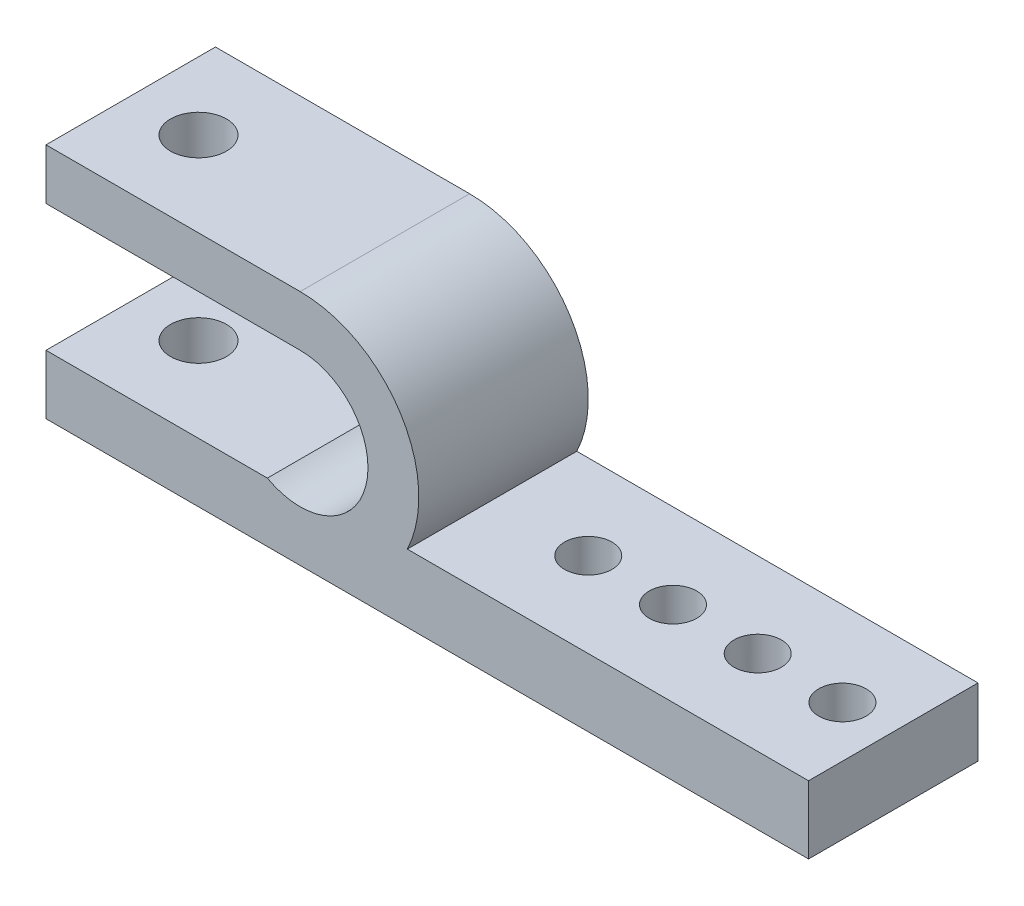
ISO-10303-21;
HEADER;
FILE_DESCRIPTION(('STEP AP214'),'2;1');
FILE_NAME('part.step','',(''),(''),'','','');
FILE_SCHEMA(('AUTOMOTIVE_DESIGN { 1 0 10303 214 1 1 1 1 }'));
ENDSEC;
DATA;
#1=APPLICATION_CONTEXT('core data for automotive mechanical design processes');
#2=APPLICATION_PROTOCOL_DEFINITION('international standard','automotive_design',2000,#1);
#3=PRODUCT_CONTEXT('',#1,'mechanical');
#4=PRODUCT('Part','Part','',(#3));
#5=PRODUCT_RELATED_PRODUCT_CATEGORY('part','',(#4));
#6=PRODUCT_DEFINITION_FORMATION('','',#4);
#7=PRODUCT_DEFINITION_CONTEXT('part definition',#1,'design');
#8=PRODUCT_DEFINITION('design','',#6,#7);
#9=PRODUCT_DEFINITION_SHAPE('','',#8);
#10=(LENGTH_UNIT() NAMED_UNIT(*) SI_UNIT(.MILLI.,.METRE.));
#11=(NAMED_UNIT(*) PLANE_ANGLE_UNIT() SI_UNIT($,.RADIAN.));
#12=(NAMED_UNIT(*) SI_UNIT($,.STERADIAN.) SOLID_ANGLE_UNIT());
#13=UNCERTAINTY_MEASURE_WITH_UNIT(LENGTH_MEASURE(1.E-05),#10,'distance_accuracy_value','');
#14=(GEOMETRIC_REPRESENTATION_CONTEXT(3) GLOBAL_UNCERTAINTY_ASSIGNED_CONTEXT((#13)) GLOBAL_UNIT_ASSIGNED_CONTEXT((#10,
#11,#12)) REPRESENTATION_CONTEXT('',''));
#15=CARTESIAN_POINT('',(0.,0.,0.));
#16=DIRECTION('',(0.,0.,1.));
#17=DIRECTION('',(1.,0.,0.));
#18=AXIS2_PLACEMENT_3D('',#15,#16,#17);
#19=CARTESIAN_POINT('',(11.6796940551831,13.1067984525851,10.));
#20=DIRECTION('',(0.,-1.,0.));
#21=DIRECTION('',(1.,0.,0.));
#22=AXIS2_PLACEMENT_3D('',#19,#20,#21);
#23=PLANE('',#22);
#24=CARTESIAN_POINT('',(0.679694055183151,13.1067984525851,5.));
#25=DIRECTION('',(0.,1.,0.));
#26=DIRECTION('',(0.,0.,1.));
#27=AXIS2_PLACEMENT_3D('',#24,#25,#26);
#28=CIRCLE('',#27,1.65);
#29=CARTESIAN_POINT('',(0.679694055183151,13.1067984525851,6.65));
#30=VERTEX_POINT('',#29);
#31=EDGE_CURVE('E184',#30,#30,#28,.T.);
#32=ORIENTED_EDGE('',*,*,#31,.T.);
#33=EDGE_LOOP('',(#32));
#34=FACE_BOUND('',#33,.T.);
#35=CARTESIAN_POINT('',(28.6796940551831,13.1067984525851,5.));
#36=DIRECTION('',(0.,-1.,0.));
#37=DIRECTION('',(1.,0.,0.));
#38=AXIS2_PLACEMENT_3D('',#35,#36,#37);
#39=CIRCLE('',#38,1.4);
#40=CARTESIAN_POINT('',(30.0796940551831,13.1067984525851,5.));
#41=VERTEX_POINT('',#40);
#42=EDGE_CURVE('E173',#41,#41,#39,.F.);
#43=ORIENTED_EDGE('',*,*,#42,.T.);
#44=EDGE_LOOP('',(#43));
#45=FACE_BOUND('',#44,.T.);
#46=CARTESIAN_POINT('',(23.6796940551831,13.1067984525851,5.));
#47=DIRECTION('',(0.,-1.,0.));
#48=DIRECTION('',(1.,0.,0.));
#49=AXIS2_PLACEMENT_3D('',#46,#47,#48);
#50=CIRCLE('',#49,1.4);
#51=CARTESIAN_POINT('',(25.0796940551831,13.1067984525851,5.));
#52=VERTEX_POINT('',#51);
#53=EDGE_CURVE('E168',#52,#52,#50,.F.);
#54=ORIENTED_EDGE('',*,*,#53,.T.);
#55=EDGE_LOOP('',(#54));
#56=FACE_BOUND('',#55,.T.);
#57=DIRECTION('',(-1.,0.,0.));
#58=VECTOR('',#57,1.);
#59=CARTESIAN_POINT('',(11.6796940551831,13.1067984525851,0.));
#60=LINE('',#59,#58);
#61=CARTESIAN_POINT('',(41.6796940551831,13.1067984525851,0.));
#62=VERTEX_POINT('',#61);
#63=CARTESIAN_POINT('',(-3.32030594481686,13.1067984525851,0.));
#64=VERTEX_POINT('',#63);
#65=EDGE_CURVE('E155',#62,#64,#60,.T.);
#66=ORIENTED_EDGE('',*,*,#65,.F.);
#67=DIRECTION('',(0.,0.,1.));
#68=VECTOR('',#67,1.);
#69=CARTESIAN_POINT('',(41.6796940551831,13.1067984525851,0.));
#70=LINE('',#69,#68);
#71=CARTESIAN_POINT('',(41.6796940551831,13.1067984525851,10.));
#72=VERTEX_POINT('',#71);
#73=EDGE_CURVE('E205',#62,#72,#70,.T.);
#74=ORIENTED_EDGE('',*,*,#73,.T.);
#75=DIRECTION('',(-1.,0.,0.));
#76=VECTOR('',#75,1.);
#77=CARTESIAN_POINT('',(11.6796940551831,13.1067984525851,10.));
#78=LINE('',#77,#76);
#79=CARTESIAN_POINT('',(-3.32030594481686,13.1067984525851,10.));
#80=VERTEX_POINT('',#79);
#81=EDGE_CURVE('E136',#72,#80,#78,.T.);
#82=ORIENTED_EDGE('',*,*,#81,.T.);
#83=DIRECTION('',(0.,0.,-1.));
#84=VECTOR('',#83,1.);
#85=CARTESIAN_POINT('',(-3.32030594481686,13.1067984525851,10.));
#86=LINE('',#85,#84);
#87=EDGE_CURVE('E59',#80,#64,#86,.T.);
#88=ORIENTED_EDGE('',*,*,#87,.T.);
#89=EDGE_LOOP('',(#66,#74,#82,#88));
#90=FACE_BOUND('',#89,.T.);
#91=CARTESIAN_POINT('',(33.6796940551831,13.1067984525851,5.));
#92=DIRECTION('',(0.,-1.,0.));
#93=DIRECTION('',(1.,0.,0.));
#94=AXIS2_PLACEMENT_3D('',#91,#92,#93);
#95=CIRCLE('',#94,1.4);
#96=CARTESIAN_POINT('',(35.0796940551831,13.1067984525851,5.));
#97=VERTEX_POINT('',#96);
#98=EDGE_CURVE('E169',#97,#97,#95,.F.);
#99=ORIENTED_EDGE('',*,*,#98,.T.);
#100=EDGE_LOOP('',(#99));
#101=FACE_BOUND('',#100,.T.);
#102=CARTESIAN_POINT('',(38.6796940551831,13.1067984525851,5.));
#103=DIRECTION('',(0.,-1.,0.));
#104=DIRECTION('',(1.,0.,0.));
#105=AXIS2_PLACEMENT_3D('',#102,#103,#104);
#106=CIRCLE('',#105,1.4);
#107=CARTESIAN_POINT('',(40.0796940551831,13.1067984525851,5.));
#108=VERTEX_POINT('',#107);
#109=EDGE_CURVE('E176',#108,#108,#106,.F.);
#110=ORIENTED_EDGE('',*,*,#109,.T.);
#111=EDGE_LOOP('',(#110));
#112=FACE_BOUND('',#111,.T.);
#113=ADVANCED_FACE('F33',(#34,#45,#56,#90,#101,#112),#23,.T.);
#114=CARTESIAN_POINT('',(41.6796940551831,17.1067984525851,0.));
#115=DIRECTION('',(0.,1.,0.));
#116=DIRECTION('',(0.,0.,1.));
#117=AXIS2_PLACEMENT_3D('',#114,#115,#116);
#118=PLANE('',#117);
#119=CARTESIAN_POINT('',(28.6796940551831,17.1067984525851,5.));
#120=DIRECTION('',(0.,1.,0.));
#121=DIRECTION('',(0.,0.,1.));
#122=AXIS2_PLACEMENT_3D('',#119,#120,#121);
#123=CIRCLE('',#122,1.4);
#124=CARTESIAN_POINT('',(28.6796940551831,17.1067984525851,6.4));
#125=VERTEX_POINT('',#124);
#126=EDGE_CURVE('E174',#125,#125,#123,.F.);
#127=ORIENTED_EDGE('',*,*,#126,.T.);
#128=EDGE_LOOP('',(#127));
#129=FACE_BOUND('',#128,.T.);
#130=CARTESIAN_POINT('',(23.6796940551831,17.1067984525851,5.));
#131=DIRECTION('',(0.,1.,0.));
#132=DIRECTION('',(0.,0.,1.));
#133=AXIS2_PLACEMENT_3D('',#130,#131,#132);
#134=CIRCLE('',#133,1.4);
#135=CARTESIAN_POINT('',(23.6796940551831,17.1067984525851,6.4));
#136=VERTEX_POINT('',#135);
#137=EDGE_CURVE('E165',#136,#136,#134,.F.);
#138=ORIENTED_EDGE('',*,*,#137,.T.);
#139=EDGE_LOOP('',(#138));
#140=FACE_BOUND('',#139,.T.);
#141=DIRECTION('',(0.,0.,-1.));
#142=VECTOR('',#141,1.);
#143=CARTESIAN_POINT('',(18.0042493755199,17.1067984525851,10.));
#144=LINE('',#143,#142);
#145=CARTESIAN_POINT('',(18.0042493755199,17.1067984525851,10.));
#146=VERTEX_POINT('',#145);
#147=CARTESIAN_POINT('',(18.0042493755199,17.1067984525851,0.));
#148=VERTEX_POINT('',#147);
#149=EDGE_CURVE('E212',#146,#148,#144,.T.);
#150=ORIENTED_EDGE('',*,*,#149,.F.);
#151=DIRECTION('',(-1.,0.,0.));
#152=VECTOR('',#151,1.);
#153=CARTESIAN_POINT('',(41.6796940551831,17.1067984525851,10.));
#154=LINE('',#153,#152);
#155=CARTESIAN_POINT('',(41.6796940551831,17.1067984525851,10.));
#156=VERTEX_POINT('',#155);
#157=EDGE_CURVE('E50',#156,#146,#154,.T.);
#158=ORIENTED_EDGE('',*,*,#157,.F.);
#159=DIRECTION('',(0.,0.,1.));
#160=VECTOR('',#159,1.);
#161=CARTESIAN_POINT('',(41.6796940551831,17.1067984525851,0.));
#162=LINE('',#161,#160);
#163=CARTESIAN_POINT('',(41.6796940551831,17.1067984525851,0.));
#164=VERTEX_POINT('',#163);
#165=EDGE_CURVE('E209',#164,#156,#162,.T.);
#166=ORIENTED_EDGE('',*,*,#165,.F.);
#167=DIRECTION('',(-1.,0.,0.));
#168=VECTOR('',#167,1.);
#169=CARTESIAN_POINT('',(41.6796940551831,17.1067984525851,0.));
#170=LINE('',#169,#168);
#171=EDGE_CURVE('E198',#164,#148,#170,.T.);
#172=ORIENTED_EDGE('',*,*,#171,.T.);
#173=EDGE_LOOP('',(#150,#158,#166,#172));
#174=FACE_BOUND('',#173,.T.);
#175=CARTESIAN_POINT('',(33.6796940551831,17.1067984525851,5.));
#176=DIRECTION('',(0.,1.,0.));
#177=DIRECTION('',(0.,0.,1.));
#178=AXIS2_PLACEMENT_3D('',#175,#176,#177);
#179=CIRCLE('',#178,1.4);
#180=CARTESIAN_POINT('',(33.6796940551831,17.1067984525851,6.4));
#181=VERTEX_POINT('',#180);
#182=EDGE_CURVE('E170',#181,#181,#179,.F.);
#183=ORIENTED_EDGE('',*,*,#182,.T.);
#184=EDGE_LOOP('',(#183));
#185=FACE_BOUND('',#184,.T.);
#186=CARTESIAN_POINT('',(38.6796940551831,17.1067984525851,5.));
#187=DIRECTION('',(0.,1.,0.));
#188=DIRECTION('',(0.,0.,1.));
#189=AXIS2_PLACEMENT_3D('',#186,#187,#188);
#190=CIRCLE('',#189,1.4);
#191=CARTESIAN_POINT('',(38.6796940551831,17.1067984525851,6.4));
#192=VERTEX_POINT('',#191);
#193=EDGE_CURVE('E177',#192,#192,#190,.F.);
#194=ORIENTED_EDGE('',*,*,#193,.T.);
#195=EDGE_LOOP('',(#194));
#196=FACE_BOUND('',#195,.T.);
#197=ADVANCED_FACE('F254',(#129,#140,#174,#185,#196),#118,.T.);
#198=CARTESIAN_POINT('',(11.6796940551831,20.1067984525851,10.));
#199=DIRECTION('',(0.,0.,-1.));
#200=DIRECTION('',(-1.,0.,0.));
#201=AXIS2_PLACEMENT_3D('',#198,#199,#200);
#202=CYLINDRICAL_SURFACE('',#201,7.);
#203=CARTESIAN_POINT('',(11.6796940551831,20.1067984525851,10.));
#204=DIRECTION('',(0.,0.,1.));
#205=DIRECTION('',(1.,0.,0.));
#206=AXIS2_PLACEMENT_3D('',#203,#204,#205);
#207=CIRCLE('',#206,7.);
#208=CARTESIAN_POINT('',(11.6796940551831,27.1067984525851,10.));
#209=VERTEX_POINT('',#208);
#210=EDGE_CURVE('E93',#146,#209,#207,.T.);
#211=ORIENTED_EDGE('',*,*,#210,.F.);
#212=ORIENTED_EDGE('',*,*,#149,.T.);
#213=CARTESIAN_POINT('',(11.6796940551831,20.1067984525851,0.));
#214=DIRECTION('',(0.,0.,1.));
#215=DIRECTION('',(1.,0.,0.));
#216=AXIS2_PLACEMENT_3D('',#213,#214,#215);
#217=CIRCLE('',#216,7.);
#218=CARTESIAN_POINT('',(11.6796940551831,27.1067984525851,0.));
#219=VERTEX_POINT('',#218);
#220=EDGE_CURVE('E138',#148,#219,#217,.T.);
#221=ORIENTED_EDGE('',*,*,#220,.T.);
#222=DIRECTION('',(0.,0.,-1.));
#223=VECTOR('',#222,1.);
#224=CARTESIAN_POINT('',(11.6796940551831,27.1067984525851,10.));
#225=LINE('',#224,#223);
#226=EDGE_CURVE('E11',#209,#219,#225,.T.);
#227=ORIENTED_EDGE('',*,*,#226,.F.);
#228=EDGE_LOOP('',(#211,#212,#221,#227));
#229=FACE_BOUND('',#228,.T.);
#230=ADVANCED_FACE('F35',(#229),#202,.T.);
#231=CARTESIAN_POINT('',(11.6796940551831,27.1067984525851,10.));
#232=DIRECTION('',(0.,-1.,0.));
#233=DIRECTION('',(0.,0.,-1.));
#234=AXIS2_PLACEMENT_3D('',#231,#232,#233);
#235=PLANE('',#234);
#236=CARTESIAN_POINT('',(0.679694055183151,27.1067984525851,5.));
#237=DIRECTION('',(0.,1.,0.));
#238=DIRECTION('',(-1.,0.,0.));
#239=AXIS2_PLACEMENT_3D('',#236,#237,#238);
#240=CIRCLE('',#239,1.65);
#241=CARTESIAN_POINT('',(-0.97030594481685,27.1067984525851,5.));
#242=VERTEX_POINT('',#241);
#243=EDGE_CURVE('E217',#242,#242,#240,.T.);
#244=ORIENTED_EDGE('',*,*,#243,.F.);
#245=EDGE_LOOP('',(#244));
#246=FACE_BOUND('',#245,.T.);
#247=DIRECTION('',(-1.,0.,0.));
#248=VECTOR('',#247,1.);
#249=CARTESIAN_POINT('',(11.6796940551831,27.1067984525851,0.));
#250=LINE('',#249,#248);
#251=CARTESIAN_POINT('',(-3.32030594481686,27.1067984525851,0.));
#252=VERTEX_POINT('',#251);
#253=EDGE_CURVE('E140',#219,#252,#250,.T.);
#254=ORIENTED_EDGE('',*,*,#253,.T.);
#255=DIRECTION('',(0.,0.,-1.));
#256=VECTOR('',#255,1.);
#257=CARTESIAN_POINT('',(-3.32030594481686,27.1067984525851,10.));
#258=LINE('',#257,#256);
#259=CARTESIAN_POINT('',(-3.32030594481686,27.1067984525851,10.));
#260=VERTEX_POINT('',#259);
#261=EDGE_CURVE('E42',#260,#252,#258,.T.);
#262=ORIENTED_EDGE('',*,*,#261,.F.);
#263=DIRECTION('',(-1.,0.,0.));
#264=VECTOR('',#263,1.);
#265=CARTESIAN_POINT('',(11.6796940551831,27.1067984525851,10.));
#266=LINE('',#265,#264);
#267=EDGE_CURVE('E223',#209,#260,#266,.T.);
#268=ORIENTED_EDGE('',*,*,#267,.F.);
#269=ORIENTED_EDGE('',*,*,#226,.T.);
#270=EDGE_LOOP('',(#254,#262,#268,#269));
#271=FACE_BOUND('',#270,.T.);
#272=ADVANCED_FACE('F259',(#246,#271),#235,.F.);
#273=CARTESIAN_POINT('',(-3.32030594481686,27.1067984525851,10.));
#274=DIRECTION('',(1.,0.,0.));
#275=DIRECTION('',(0.,1.,0.));
#276=AXIS2_PLACEMENT_3D('',#273,#274,#275);
#277=PLANE('',#276);
#278=DIRECTION('',(0.,-1.,0.));
#279=VECTOR('',#278,1.);
#280=CARTESIAN_POINT('',(-3.32030594481686,27.1067984525851,0.));
#281=LINE('',#280,#279);
#282=CARTESIAN_POINT('',(-3.32030594481686,24.1067984525851,0.));
#283=VERTEX_POINT('',#282);
#284=EDGE_CURVE('E143',#252,#283,#281,.T.);
#285=ORIENTED_EDGE('',*,*,#284,.T.);
#286=DIRECTION('',(0.,0.,-1.));
#287=VECTOR('',#286,1.);
#288=CARTESIAN_POINT('',(-3.32030594481686,24.1067984525851,10.));
#289=LINE('',#288,#287);
#290=CARTESIAN_POINT('',(-3.32030594481686,24.1067984525851,10.));
#291=VERTEX_POINT('',#290);
#292=EDGE_CURVE('E161',#291,#283,#289,.T.);
#293=ORIENTED_EDGE('',*,*,#292,.F.);
#294=DIRECTION('',(0.,-1.,0.));
#295=VECTOR('',#294,1.);
#296=CARTESIAN_POINT('',(-3.32030594481686,27.1067984525851,10.));
#297=LINE('',#296,#295);
#298=EDGE_CURVE('E131',#260,#291,#297,.T.);
#299=ORIENTED_EDGE('',*,*,#298,.F.);
#300=ORIENTED_EDGE('',*,*,#261,.T.);
#301=EDGE_LOOP('',(#285,#293,#299,#300));
#302=FACE_BOUND('',#301,.T.);
#303=ADVANCED_FACE('F228',(#302),#277,.F.);
#304=CARTESIAN_POINT('',(11.6796940551831,24.1067984525851,10.));
#305=DIRECTION('',(0.,-1.,0.));
#306=DIRECTION('',(0.,0.,-1.));
#307=AXIS2_PLACEMENT_3D('',#304,#305,#306);
#308=PLANE('',#307);
#309=CARTESIAN_POINT('',(0.679694055183152,24.1067984525851,5.));
#310=DIRECTION('',(0.,-1.,0.));
#311=DIRECTION('',(0.,0.,-1.));
#312=AXIS2_PLACEMENT_3D('',#309,#310,#311);
#313=CIRCLE('',#312,1.65);
#314=CARTESIAN_POINT('',(0.679694055183152,24.1067984525851,3.35));
#315=VERTEX_POINT('',#314);
#316=EDGE_CURVE('E141',#315,#315,#313,.T.);
#317=ORIENTED_EDGE('',*,*,#316,.F.);
#318=EDGE_LOOP('',(#317));
#319=FACE_BOUND('',#318,.T.);
#320=DIRECTION('',(-1.,0.,0.));
#321=VECTOR('',#320,1.);
#322=CARTESIAN_POINT('',(11.6796940551831,24.1067984525851,0.));
#323=LINE('',#322,#321);
#324=CARTESIAN_POINT('',(11.6796940551831,24.1067984525851,0.));
#325=VERTEX_POINT('',#324);
#326=EDGE_CURVE('E146',#325,#283,#323,.T.);
#327=ORIENTED_EDGE('',*,*,#326,.F.);
#328=DIRECTION('',(0.,0.,-1.));
#329=VECTOR('',#328,1.);
#330=CARTESIAN_POINT('',(11.6796940551831,24.1067984525851,10.));
#331=LINE('',#330,#329);
#332=CARTESIAN_POINT('',(11.6796940551831,24.1067984525851,10.));
#333=VERTEX_POINT('',#332);
#334=EDGE_CURVE('E118',#333,#325,#331,.T.);
#335=ORIENTED_EDGE('',*,*,#334,.F.);
#336=DIRECTION('',(-1.,0.,0.));
#337=VECTOR('',#336,1.);
#338=CARTESIAN_POINT('',(11.6796940551831,24.1067984525851,10.));
#339=LINE('',#338,#337);
#340=EDGE_CURVE('E129',#333,#291,#339,.T.);
#341=ORIENTED_EDGE('',*,*,#340,.T.);
#342=ORIENTED_EDGE('',*,*,#292,.T.);
#343=EDGE_LOOP('',(#327,#335,#341,#342));
#344=FACE_BOUND('',#343,.T.);
#345=ADVANCED_FACE('F232',(#319,#344),#308,.T.);
#346=CARTESIAN_POINT('',(11.6796940551831,20.1067984525851,10.));
#347=DIRECTION('',(0.,0.,-1.));
#348=DIRECTION('',(-1.,0.,0.));
#349=AXIS2_PLACEMENT_3D('',#346,#347,#348);
#350=CYLINDRICAL_SURFACE('',#349,4.);
#351=ORIENTED_EDGE('',*,*,#334,.T.);
#352=CARTESIAN_POINT('',(11.6796940551831,20.1067984525851,0.));
#353=DIRECTION('',(0.,0.,1.));
#354=DIRECTION('',(1.,0.,0.));
#355=AXIS2_PLACEMENT_3D('',#352,#353,#354);
#356=CIRCLE('',#355,4.);
#357=CARTESIAN_POINT('',(9.74320238207943,16.6067984525851,0.));
#358=VERTEX_POINT('',#357);
#359=EDGE_CURVE('E114',#358,#325,#356,.T.);
#360=ORIENTED_EDGE('',*,*,#359,.F.);
#361=DIRECTION('',(0.,0.,-1.));
#362=VECTOR('',#361,1.);
#363=CARTESIAN_POINT('',(9.74320238207943,16.6067984525851,10.));
#364=LINE('',#363,#362);
#365=CARTESIAN_POINT('',(9.74320238207943,16.6067984525851,10.));
#366=VERTEX_POINT('',#365);
#367=EDGE_CURVE('E107',#366,#358,#364,.T.);
#368=ORIENTED_EDGE('',*,*,#367,.F.);
#369=CARTESIAN_POINT('',(11.6796940551831,20.1067984525851,10.));
#370=DIRECTION('',(0.,0.,1.));
#371=DIRECTION('',(1.,0.,0.));
#372=AXIS2_PLACEMENT_3D('',#369,#370,#371);
#373=CIRCLE('',#372,4.);
#374=EDGE_CURVE('E112',#366,#333,#373,.T.);
#375=ORIENTED_EDGE('',*,*,#374,.T.);
#376=EDGE_LOOP('',(#351,#360,#368,#375));
#377=FACE_BOUND('',#376,.T.);
#378=ADVANCED_FACE('F110',(#377),#350,.F.);
#379=CARTESIAN_POINT('',(9.74320238207943,16.6067984525851,10.));
#380=DIRECTION('',(0.,-1.,0.));
#381=DIRECTION('',(1.,0.,0.));
#382=AXIS2_PLACEMENT_3D('',#379,#380,#381);
#383=PLANE('',#382);
#384=CARTESIAN_POINT('',(0.679694055183151,16.6067984525851,5.));
#385=DIRECTION('',(0.,-1.,0.));
#386=DIRECTION('',(1.,0.,0.));
#387=AXIS2_PLACEMENT_3D('',#384,#385,#386);
#388=CIRCLE('',#387,1.65);
#389=CARTESIAN_POINT('',(2.32969405518315,16.6067984525851,5.));
#390=VERTEX_POINT('',#389);
#391=EDGE_CURVE('E37',#390,#390,#388,.T.);
#392=ORIENTED_EDGE('',*,*,#391,.T.);
#393=EDGE_LOOP('',(#392));
#394=FACE_BOUND('',#393,.T.);
#395=DIRECTION('',(-1.,0.,0.));
#396=VECTOR('',#395,1.);
#397=CARTESIAN_POINT('',(9.74320238207943,16.6067984525851,0.));
#398=LINE('',#397,#396);
#399=CARTESIAN_POINT('',(-3.32030594481686,16.6067984525851,0.));
#400=VERTEX_POINT('',#399);
#401=EDGE_CURVE('E150',#358,#400,#398,.T.);
#402=ORIENTED_EDGE('',*,*,#401,.T.);
#403=DIRECTION('',(0.,0.,-1.));
#404=VECTOR('',#403,1.);
#405=CARTESIAN_POINT('',(-3.32030594481686,16.6067984525851,10.));
#406=LINE('',#405,#404);
#407=CARTESIAN_POINT('',(-3.32030594481686,16.6067984525851,10.));
#408=VERTEX_POINT('',#407);
#409=EDGE_CURVE('E119',#408,#400,#406,.T.);
#410=ORIENTED_EDGE('',*,*,#409,.F.);
#411=DIRECTION('',(-1.,0.,0.));
#412=VECTOR('',#411,1.);
#413=CARTESIAN_POINT('',(9.74320238207943,16.6067984525851,10.));
#414=LINE('',#413,#412);
#415=EDGE_CURVE('E122',#366,#408,#414,.T.);
#416=ORIENTED_EDGE('',*,*,#415,.F.);
#417=ORIENTED_EDGE('',*,*,#367,.T.);
#418=EDGE_LOOP('',(#402,#410,#416,#417));
#419=FACE_BOUND('',#418,.T.);
#420=ADVANCED_FACE('F123',(#394,#419),#383,.F.);
#421=CARTESIAN_POINT('',(-3.32030594481686,13.1067984525851,10.));
#422=DIRECTION('',(-1.,0.,0.));
#423=DIRECTION('',(0.,0.,1.));
#424=AXIS2_PLACEMENT_3D('',#421,#422,#423);
#425=PLANE('',#424);
#426=DIRECTION('',(0.,1.,0.));
#427=VECTOR('',#426,1.);
#428=CARTESIAN_POINT('',(-3.32030594481686,13.1067984525851,0.));
#429=LINE('',#428,#427);
#430=EDGE_CURVE('E152',#64,#400,#429,.T.);
#431=ORIENTED_EDGE('',*,*,#430,.F.);
#432=ORIENTED_EDGE('',*,*,#87,.F.);
#433=DIRECTION('',(0.,1.,0.));
#434=VECTOR('',#433,1.);
#435=CARTESIAN_POINT('',(-3.32030594481686,13.1067984525851,10.));
#436=LINE('',#435,#434);
#437=EDGE_CURVE('E124',#80,#408,#436,.T.);
#438=ORIENTED_EDGE('',*,*,#437,.T.);
#439=ORIENTED_EDGE('',*,*,#409,.T.);
#440=EDGE_LOOP('',(#431,#432,#438,#439));
#441=FACE_BOUND('',#440,.T.);
#442=ADVANCED_FACE('F237',(#441),#425,.T.);
#443=CARTESIAN_POINT('',(11.6796940551831,20.1067984525851,10.));
#444=DIRECTION('',(0.,0.,1.));
#445=DIRECTION('',(1.,0.,0.));
#446=AXIS2_PLACEMENT_3D('',#443,#444,#445);
#447=PLANE('',#446);
#448=ORIENTED_EDGE('',*,*,#340,.F.);
#449=ORIENTED_EDGE('',*,*,#374,.F.);
#450=ORIENTED_EDGE('',*,*,#415,.T.);
#451=ORIENTED_EDGE('',*,*,#437,.F.);
#452=ORIENTED_EDGE('',*,*,#81,.F.);
#453=DIRECTION('',(0.,-1.,0.));
#454=VECTOR('',#453,1.);
#455=CARTESIAN_POINT('',(41.6796940551831,17.1067984525851,10.));
#456=LINE('',#455,#454);
#457=EDGE_CURVE('E202',#156,#72,#456,.T.);
#458=ORIENTED_EDGE('',*,*,#457,.F.);
#459=ORIENTED_EDGE('',*,*,#157,.T.);
#460=ORIENTED_EDGE('',*,*,#210,.T.);
#461=ORIENTED_EDGE('',*,*,#267,.T.);
#462=ORIENTED_EDGE('',*,*,#298,.T.);
#463=EDGE_LOOP('',(#448,#449,#450,#451,#452,#458,#459,#460,#461,#462));
#464=FACE_BOUND('',#463,.T.);
#465=ADVANCED_FACE('F127',(#464),#447,.T.);
#466=CARTESIAN_POINT('',(11.6796940551831,20.1067984525851,0.));
#467=DIRECTION('',(0.,0.,1.));
#468=DIRECTION('',(1.,0.,0.));
#469=AXIS2_PLACEMENT_3D('',#466,#467,#468);
#470=PLANE('',#469);
#471=ORIENTED_EDGE('',*,*,#220,.F.);
#472=ORIENTED_EDGE('',*,*,#171,.F.);
#473=DIRECTION('',(0.,-1.,0.));
#474=VECTOR('',#473,1.);
#475=CARTESIAN_POINT('',(41.6796940551831,17.1067984525851,0.));
#476=LINE('',#475,#474);
#477=EDGE_CURVE('E201',#164,#62,#476,.T.);
#478=ORIENTED_EDGE('',*,*,#477,.T.);
#479=ORIENTED_EDGE('',*,*,#65,.T.);
#480=ORIENTED_EDGE('',*,*,#430,.T.);
#481=ORIENTED_EDGE('',*,*,#401,.F.);
#482=ORIENTED_EDGE('',*,*,#359,.T.);
#483=ORIENTED_EDGE('',*,*,#326,.T.);
#484=ORIENTED_EDGE('',*,*,#284,.F.);
#485=ORIENTED_EDGE('',*,*,#253,.F.);
#486=EDGE_LOOP('',(#471,#472,#478,#479,#480,#481,#482,#483,#484,#485));
#487=FACE_BOUND('',#486,.T.);
#488=ADVANCED_FACE('F235',(#487),#470,.F.);
#489=CARTESIAN_POINT('',(0.679694055183157,13.1067984525851,5.));
#490=DIRECTION('',(0.,1.,0.));
#491=DIRECTION('',(-1.,0.,0.));
#492=AXIS2_PLACEMENT_3D('',#489,#490,#491);
#493=CYLINDRICAL_SURFACE('',#492,1.65);
#494=ORIENTED_EDGE('',*,*,#316,.T.);
#495=EDGE_LOOP('',(#494));
#496=FACE_BOUND('',#495,.T.);
#497=ORIENTED_EDGE('',*,*,#243,.T.);
#498=EDGE_LOOP('',(#497));
#499=FACE_BOUND('',#498,.T.);
#500=ADVANCED_FACE('F291',(#496,#499),#493,.F.);
#501=CARTESIAN_POINT('',(41.6796940551831,17.1067984525851,0.));
#502=DIRECTION('',(-1.,0.,0.));
#503=DIRECTION('',(0.,0.,1.));
#504=AXIS2_PLACEMENT_3D('',#501,#502,#503);
#505=PLANE('',#504);
#506=ORIENTED_EDGE('',*,*,#457,.T.);
#507=ORIENTED_EDGE('',*,*,#73,.F.);
#508=ORIENTED_EDGE('',*,*,#477,.F.);
#509=ORIENTED_EDGE('',*,*,#165,.T.);
#510=EDGE_LOOP('',(#506,#507,#508,#509));
#511=FACE_BOUND('',#510,.T.);
#512=ADVANCED_FACE('F247',(#511),#505,.F.);
#513=CARTESIAN_POINT('',(23.6796940551831,23.9489224328462,5.));
#514=DIRECTION('',(0.,-1.,0.));
#515=DIRECTION('',(0.,0.,-1.));
#516=AXIS2_PLACEMENT_3D('',#513,#514,#515);
#517=CYLINDRICAL_SURFACE('',#516,1.4);
#518=ORIENTED_EDGE('',*,*,#53,.F.);
#519=EDGE_LOOP('',(#518));
#520=FACE_BOUND('',#519,.T.);
#521=ORIENTED_EDGE('',*,*,#137,.F.);
#522=EDGE_LOOP('',(#521));
#523=FACE_BOUND('',#522,.T.);
#524=ADVANCED_FACE('F299',(#520,#523),#517,.F.);
#525=CARTESIAN_POINT('',(33.6796940551831,23.9489224328462,5.));
#526=DIRECTION('',(0.,-1.,0.));
#527=DIRECTION('',(0.,0.,-1.));
#528=AXIS2_PLACEMENT_3D('',#525,#526,#527);
#529=CYLINDRICAL_SURFACE('',#528,1.4);
#530=ORIENTED_EDGE('',*,*,#98,.F.);
#531=EDGE_LOOP('',(#530));
#532=FACE_BOUND('',#531,.T.);
#533=ORIENTED_EDGE('',*,*,#182,.F.);
#534=EDGE_LOOP('',(#533));
#535=FACE_BOUND('',#534,.T.);
#536=ADVANCED_FACE('F334',(#532,#535),#529,.F.);
#537=CARTESIAN_POINT('',(28.6796940551831,23.9489224328462,5.));
#538=DIRECTION('',(0.,-1.,0.));
#539=DIRECTION('',(0.,0.,-1.));
#540=AXIS2_PLACEMENT_3D('',#537,#538,#539);
#541=CYLINDRICAL_SURFACE('',#540,1.4);
#542=ORIENTED_EDGE('',*,*,#42,.F.);
#543=EDGE_LOOP('',(#542));
#544=FACE_BOUND('',#543,.T.);
#545=ORIENTED_EDGE('',*,*,#126,.F.);
#546=EDGE_LOOP('',(#545));
#547=FACE_BOUND('',#546,.T.);
#548=ADVANCED_FACE('F345',(#544,#547),#541,.F.);
#549=CARTESIAN_POINT('',(38.6796940551831,23.9489224328462,5.));
#550=DIRECTION('',(0.,-1.,0.));
#551=DIRECTION('',(0.,0.,-1.));
#552=AXIS2_PLACEMENT_3D('',#549,#550,#551);
#553=CYLINDRICAL_SURFACE('',#552,1.4);
#554=ORIENTED_EDGE('',*,*,#109,.F.);
#555=EDGE_LOOP('',(#554));
#556=FACE_BOUND('',#555,.T.);
#557=ORIENTED_EDGE('',*,*,#193,.F.);
#558=EDGE_LOOP('',(#557));
#559=FACE_BOUND('',#558,.T.);
#560=ADVANCED_FACE('F355',(#556,#559),#553,.F.);
#561=CARTESIAN_POINT('',(0.679694055183151,13.1067984525851,5.));
#562=DIRECTION('',(0.,1.,0.));
#563=DIRECTION('',(0.,0.,1.));
#564=AXIS2_PLACEMENT_3D('',#561,#562,#563);
#565=CYLINDRICAL_SURFACE('',#564,1.65);
#566=ORIENTED_EDGE('',*,*,#31,.F.);
#567=EDGE_LOOP('',(#566));
#568=FACE_BOUND('',#567,.T.);
#569=ORIENTED_EDGE('',*,*,#391,.F.);
#570=EDGE_LOOP('',(#569));
#571=FACE_BOUND('',#570,.T.);
#572=ADVANCED_FACE('F364',(#568,#571),#565,.F.);
#573=CLOSED_SHELL('',(#113,#197,#230,#272,#303,#345,#378,#420,#442,#465,#488,#500,#512,#524,
#536,#548,#560,#572));
#574=MANIFOLD_SOLID_BREP('B2',#573);
#575=ADVANCED_BREP_SHAPE_REPRESENTATION('',(#18,#574),#14);
#576=SHAPE_DEFINITION_REPRESENTATION(#9,#575);
ENDSEC;
END-ISO-10303-21;
